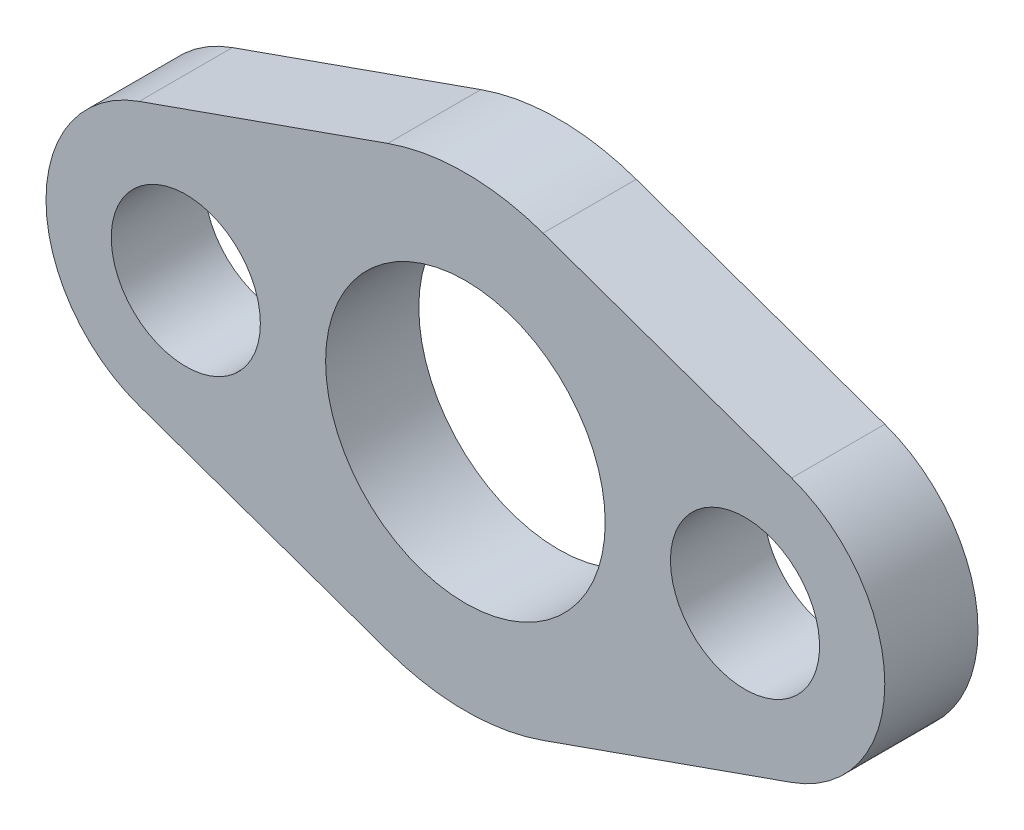
ISO-10303-21;
HEADER;
FILE_DESCRIPTION(('STEP AP214'),'2;1');
FILE_NAME('part.step','',(''),(''),'','','');
FILE_SCHEMA(('AUTOMOTIVE_DESIGN { 1 0 10303 214 1 1 1 1 }'));
ENDSEC;
DATA;
#1=APPLICATION_CONTEXT('core data for automotive mechanical design processes');
#2=APPLICATION_PROTOCOL_DEFINITION('international standard','automotive_design',2000,#1);
#3=PRODUCT_CONTEXT('',#1,'mechanical');
#4=PRODUCT('Part','Part','',(#3));
#5=PRODUCT_RELATED_PRODUCT_CATEGORY('part','',(#4));
#6=PRODUCT_DEFINITION_FORMATION('','',#4);
#7=PRODUCT_DEFINITION_CONTEXT('part definition',#1,'design');
#8=PRODUCT_DEFINITION('design','',#6,#7);
#9=PRODUCT_DEFINITION_SHAPE('','',#8);
#10=(LENGTH_UNIT() NAMED_UNIT(*) SI_UNIT(.MILLI.,.METRE.));
#11=(NAMED_UNIT(*) PLANE_ANGLE_UNIT() SI_UNIT($,.RADIAN.));
#12=(NAMED_UNIT(*) SI_UNIT($,.STERADIAN.) SOLID_ANGLE_UNIT());
#13=UNCERTAINTY_MEASURE_WITH_UNIT(LENGTH_MEASURE(1.E-05),#10,'distance_accuracy_value','');
#14=(GEOMETRIC_REPRESENTATION_CONTEXT(3) GLOBAL_UNCERTAINTY_ASSIGNED_CONTEXT((#13)) GLOBAL_UNIT_ASSIGNED_CONTEXT((#10,
#11,#12)) REPRESENTATION_CONTEXT('',''));
#15=CARTESIAN_POINT('',(0.,0.,0.));
#16=DIRECTION('',(0.,0.,1.));
#17=DIRECTION('',(1.,0.,0.));
#18=AXIS2_PLACEMENT_3D('',#15,#16,#17);
#19=CARTESIAN_POINT('',(0.,0.,10.));
#20=DIRECTION('',(0.,0.,1.));
#21=DIRECTION('',(1.,0.,0.));
#22=AXIS2_PLACEMENT_3D('',#19,#20,#21);
#23=PLANE('',#22);
#24=CARTESIAN_POINT('',(30.,0.,10.));
#25=DIRECTION('',(0.,0.,1.));
#26=DIRECTION('',(1.,0.,0.));
#27=AXIS2_PLACEMENT_3D('',#24,#25,#26);
#28=CIRCLE('',#27,15.);
#29=CARTESIAN_POINT('',(45.,0.,10.));
#30=VERTEX_POINT('',#29);
#31=EDGE_CURVE('E181',#30,#30,#28,.T.);
#32=ORIENTED_EDGE('',*,*,#31,.F.);
#33=EDGE_LOOP('',(#32));
#34=FACE_BOUND('',#33,.T.);
#35=CARTESIAN_POINT('',(0.,0.,10.));
#36=DIRECTION('',(0.,0.,1.));
#37=DIRECTION('',(1.,0.,0.));
#38=AXIS2_PLACEMENT_3D('',#35,#36,#37);
#39=CIRCLE('',#38,15.);
#40=CARTESIAN_POINT('',(-5.00000000000001,14.142135623731,10.));
#41=VERTEX_POINT('',#40);
#42=CARTESIAN_POINT('',(-5.00000000000001,-14.142135623731,10.));
#43=VERTEX_POINT('',#42);
#44=EDGE_CURVE('E144',#41,#43,#39,.T.);
#45=ORIENTED_EDGE('',*,*,#44,.T.);
#46=DIRECTION('',(0.942809041582063,-0.333333333333334,0.));
#47=VECTOR('',#46,1.);
#48=CARTESIAN_POINT('',(-5.00000000000001,-14.142135623731,10.));
#49=LINE('',#48,#47);
#50=CARTESIAN_POINT('',(21.6666666666667,-23.5702260395516,10.));
#51=VERTEX_POINT('',#50);
#52=EDGE_CURVE('E92',#43,#51,#49,.T.);
#53=ORIENTED_EDGE('',*,*,#52,.T.);
#54=CARTESIAN_POINT('',(30.,0.,10.));
#55=DIRECTION('',(0.,0.,1.));
#56=DIRECTION('',(1.,0.,0.));
#57=AXIS2_PLACEMENT_3D('',#54,#55,#56);
#58=CIRCLE('',#57,25.);
#59=CARTESIAN_POINT('',(38.3333333333333,-23.5702260395516,10.));
#60=VERTEX_POINT('',#59);
#61=EDGE_CURVE('E159',#51,#60,#58,.T.);
#62=ORIENTED_EDGE('',*,*,#61,.T.);
#63=DIRECTION('',(0.942809041582063,0.333333333333334,0.));
#64=VECTOR('',#63,1.);
#65=CARTESIAN_POINT('',(65.,-14.142135623731,10.));
#66=LINE('',#65,#64);
#67=CARTESIAN_POINT('',(65.,-14.142135623731,10.));
#68=VERTEX_POINT('',#67);
#69=EDGE_CURVE('E172',#60,#68,#66,.T.);
#70=ORIENTED_EDGE('',*,*,#69,.T.);
#71=CARTESIAN_POINT('',(60.,0.,10.));
#72=DIRECTION('',(0.,0.,1.));
#73=DIRECTION('',(-1.,0.,0.));
#74=AXIS2_PLACEMENT_3D('',#71,#72,#73);
#75=CIRCLE('',#74,15.);
#76=CARTESIAN_POINT('',(65.,14.1421356237309,10.));
#77=VERTEX_POINT('',#76);
#78=EDGE_CURVE('E111',#68,#77,#75,.T.);
#79=ORIENTED_EDGE('',*,*,#78,.T.);
#80=DIRECTION('',(-0.942809041582063,0.333333333333334,0.));
#81=VECTOR('',#80,1.);
#82=CARTESIAN_POINT('',(65.,14.142135623731,10.));
#83=LINE('',#82,#81);
#84=CARTESIAN_POINT('',(38.3333333333333,23.5702260395516,10.));
#85=VERTEX_POINT('',#84);
#86=EDGE_CURVE('E105',#77,#85,#83,.T.);
#87=ORIENTED_EDGE('',*,*,#86,.T.);
#88=CARTESIAN_POINT('',(30.,0.,10.));
#89=DIRECTION('',(0.,0.,1.));
#90=DIRECTION('',(1.,0.,0.));
#91=AXIS2_PLACEMENT_3D('',#88,#89,#90);
#92=CIRCLE('',#91,25.);
#93=CARTESIAN_POINT('',(21.6666666666667,23.5702260395516,10.));
#94=VERTEX_POINT('',#93);
#95=EDGE_CURVE('E109',#85,#94,#92,.T.);
#96=ORIENTED_EDGE('',*,*,#95,.T.);
#97=DIRECTION('',(-0.942809041582063,-0.333333333333334,0.));
#98=VECTOR('',#97,1.);
#99=CARTESIAN_POINT('',(-5.00000000000001,14.142135623731,10.));
#100=LINE('',#99,#98);
#101=EDGE_CURVE('E49',#94,#41,#100,.T.);
#102=ORIENTED_EDGE('',*,*,#101,.T.);
#103=EDGE_LOOP('',(#45,#53,#62,#70,#79,#87,#96,#102));
#104=FACE_BOUND('',#103,.T.);
#105=CARTESIAN_POINT('',(0.,0.,10.));
#106=DIRECTION('',(0.,0.,1.));
#107=DIRECTION('',(1.,0.,0.));
#108=AXIS2_PLACEMENT_3D('',#105,#106,#107);
#109=CIRCLE('',#108,8.);
#110=CARTESIAN_POINT('',(8.,0.,10.));
#111=VERTEX_POINT('',#110);
#112=EDGE_CURVE('E133',#111,#111,#109,.T.);
#113=ORIENTED_EDGE('',*,*,#112,.F.);
#114=EDGE_LOOP('',(#113));
#115=FACE_BOUND('',#114,.T.);
#116=CARTESIAN_POINT('',(60.,0.,10.));
#117=DIRECTION('',(0.,0.,1.));
#118=DIRECTION('',(-1.,0.,0.));
#119=AXIS2_PLACEMENT_3D('',#116,#117,#118);
#120=CIRCLE('',#119,8.00000000000001);
#121=CARTESIAN_POINT('',(52.,0.,10.));
#122=VERTEX_POINT('',#121);
#123=EDGE_CURVE('E187',#122,#122,#120,.T.);
#124=ORIENTED_EDGE('',*,*,#123,.F.);
#125=EDGE_LOOP('',(#124));
#126=FACE_BOUND('',#125,.T.);
#127=ADVANCED_FACE('F32',(#34,#104,#115,#126),#23,.T.);
#128=CARTESIAN_POINT('',(0.,0.,0.));
#129=DIRECTION('',(0.,0.,1.));
#130=DIRECTION('',(1.,0.,0.));
#131=AXIS2_PLACEMENT_3D('',#128,#129,#130);
#132=PLANE('',#131);
#133=CARTESIAN_POINT('',(0.,0.,0.));
#134=DIRECTION('',(0.,0.,1.));
#135=DIRECTION('',(1.,0.,0.));
#136=AXIS2_PLACEMENT_3D('',#133,#134,#135);
#137=CIRCLE('',#136,15.);
#138=CARTESIAN_POINT('',(-5.00000000000001,14.142135623731,0.));
#139=VERTEX_POINT('',#138);
#140=CARTESIAN_POINT('',(-5.00000000000001,-14.142135623731,0.));
#141=VERTEX_POINT('',#140);
#142=EDGE_CURVE('E129',#139,#141,#137,.T.);
#143=ORIENTED_EDGE('',*,*,#142,.F.);
#144=DIRECTION('',(-0.942809041582063,-0.333333333333334,0.));
#145=VECTOR('',#144,1.);
#146=CARTESIAN_POINT('',(-5.00000000000001,14.142135623731,0.));
#147=LINE('',#146,#145);
#148=CARTESIAN_POINT('',(21.6666666666667,23.5702260395516,0.));
#149=VERTEX_POINT('',#148);
#150=EDGE_CURVE('E84',#149,#139,#147,.T.);
#151=ORIENTED_EDGE('',*,*,#150,.F.);
#152=CARTESIAN_POINT('',(30.,0.,0.));
#153=DIRECTION('',(0.,0.,1.));
#154=DIRECTION('',(1.,0.,0.));
#155=AXIS2_PLACEMENT_3D('',#152,#153,#154);
#156=CIRCLE('',#155,25.);
#157=CARTESIAN_POINT('',(38.3333333333333,23.5702260395516,0.));
#158=VERTEX_POINT('',#157);
#159=EDGE_CURVE('E78',#158,#149,#156,.T.);
#160=ORIENTED_EDGE('',*,*,#159,.F.);
#161=DIRECTION('',(-0.942809041582063,0.333333333333334,0.));
#162=VECTOR('',#161,1.);
#163=CARTESIAN_POINT('',(65.,14.142135623731,0.));
#164=LINE('',#163,#162);
#165=CARTESIAN_POINT('',(65.,14.1421356237309,0.));
#166=VERTEX_POINT('',#165);
#167=EDGE_CURVE('E119',#166,#158,#164,.T.);
#168=ORIENTED_EDGE('',*,*,#167,.F.);
#169=CARTESIAN_POINT('',(60.,0.,0.));
#170=DIRECTION('',(0.,0.,1.));
#171=DIRECTION('',(-1.,0.,0.));
#172=AXIS2_PLACEMENT_3D('',#169,#170,#171);
#173=CIRCLE('',#172,15.);
#174=CARTESIAN_POINT('',(65.,-14.142135623731,0.));
#175=VERTEX_POINT('',#174);
#176=EDGE_CURVE('E139',#175,#166,#173,.T.);
#177=ORIENTED_EDGE('',*,*,#176,.F.);
#178=DIRECTION('',(0.942809041582063,0.333333333333334,0.));
#179=VECTOR('',#178,1.);
#180=CARTESIAN_POINT('',(65.,-14.142135623731,0.));
#181=LINE('',#180,#179);
#182=CARTESIAN_POINT('',(38.3333333333333,-23.5702260395516,0.));
#183=VERTEX_POINT('',#182);
#184=EDGE_CURVE('E137',#183,#175,#181,.T.);
#185=ORIENTED_EDGE('',*,*,#184,.F.);
#186=CARTESIAN_POINT('',(30.,0.,0.));
#187=DIRECTION('',(0.,0.,1.));
#188=DIRECTION('',(1.,0.,0.));
#189=AXIS2_PLACEMENT_3D('',#186,#187,#188);
#190=CIRCLE('',#189,25.);
#191=CARTESIAN_POINT('',(21.6666666666667,-23.5702260395516,0.));
#192=VERTEX_POINT('',#191);
#193=EDGE_CURVE('E135',#192,#183,#190,.T.);
#194=ORIENTED_EDGE('',*,*,#193,.F.);
#195=DIRECTION('',(0.942809041582063,-0.333333333333334,0.));
#196=VECTOR('',#195,1.);
#197=CARTESIAN_POINT('',(-5.00000000000001,-14.142135623731,0.));
#198=LINE('',#197,#196);
#199=EDGE_CURVE('E132',#141,#192,#198,.T.);
#200=ORIENTED_EDGE('',*,*,#199,.F.);
#201=EDGE_LOOP('',(#143,#151,#160,#168,#177,#185,#194,#200));
#202=FACE_BOUND('',#201,.T.);
#203=CARTESIAN_POINT('',(0.,0.,0.));
#204=DIRECTION('',(0.,0.,1.));
#205=DIRECTION('',(1.,0.,0.));
#206=AXIS2_PLACEMENT_3D('',#203,#204,#205);
#207=CIRCLE('',#206,8.);
#208=CARTESIAN_POINT('',(8.,0.,0.));
#209=VERTEX_POINT('',#208);
#210=EDGE_CURVE('E178',#209,#209,#207,.T.);
#211=ORIENTED_EDGE('',*,*,#210,.T.);
#212=EDGE_LOOP('',(#211));
#213=FACE_BOUND('',#212,.T.);
#214=CARTESIAN_POINT('',(30.,0.,0.));
#215=DIRECTION('',(0.,0.,1.));
#216=DIRECTION('',(1.,0.,0.));
#217=AXIS2_PLACEMENT_3D('',#214,#215,#216);
#218=CIRCLE('',#217,15.);
#219=CARTESIAN_POINT('',(45.,0.,0.));
#220=VERTEX_POINT('',#219);
#221=EDGE_CURVE('E184',#220,#220,#218,.T.);
#222=ORIENTED_EDGE('',*,*,#221,.T.);
#223=EDGE_LOOP('',(#222));
#224=FACE_BOUND('',#223,.T.);
#225=CARTESIAN_POINT('',(60.,0.,0.));
#226=DIRECTION('',(0.,0.,1.));
#227=DIRECTION('',(-1.,0.,0.));
#228=AXIS2_PLACEMENT_3D('',#225,#226,#227);
#229=CIRCLE('',#228,8.00000000000001);
#230=CARTESIAN_POINT('',(52.,0.,0.));
#231=VERTEX_POINT('',#230);
#232=EDGE_CURVE('E190',#231,#231,#229,.T.);
#233=ORIENTED_EDGE('',*,*,#232,.T.);
#234=EDGE_LOOP('',(#233));
#235=FACE_BOUND('',#234,.T.);
#236=ADVANCED_FACE('F163',(#202,#213,#224,#235),#132,.F.);
#237=CARTESIAN_POINT('',(0.,0.,10.));
#238=DIRECTION('',(0.,0.,-1.));
#239=DIRECTION('',(-1.,0.,0.));
#240=AXIS2_PLACEMENT_3D('',#237,#238,#239);
#241=CYLINDRICAL_SURFACE('',#240,15.);
#242=ORIENTED_EDGE('',*,*,#142,.T.);
#243=DIRECTION('',(0.,0.,-1.));
#244=VECTOR('',#243,1.);
#245=CARTESIAN_POINT('',(-5.00000000000001,-14.142135623731,10.));
#246=LINE('',#245,#244);
#247=EDGE_CURVE('E11',#43,#141,#246,.T.);
#248=ORIENTED_EDGE('',*,*,#247,.F.);
#249=ORIENTED_EDGE('',*,*,#44,.F.);
#250=DIRECTION('',(0.,0.,-1.));
#251=VECTOR('',#250,1.);
#252=CARTESIAN_POINT('',(-5.00000000000001,14.142135623731,10.));
#253=LINE('',#252,#251);
#254=EDGE_CURVE('E125',#41,#139,#253,.T.);
#255=ORIENTED_EDGE('',*,*,#254,.T.);
#256=EDGE_LOOP('',(#242,#248,#249,#255));
#257=FACE_BOUND('',#256,.T.);
#258=ADVANCED_FACE('F34',(#257),#241,.T.);
#259=CARTESIAN_POINT('',(-5.00000000000001,-14.142135623731,10.));
#260=DIRECTION('',(0.333333333333334,0.942809041582063,0.));
#261=DIRECTION('',(-0.942809041582063,0.333333333333334,0.));
#262=AXIS2_PLACEMENT_3D('',#259,#260,#261);
#263=PLANE('',#262);
#264=ORIENTED_EDGE('',*,*,#199,.T.);
#265=DIRECTION('',(0.,0.,-1.));
#266=VECTOR('',#265,1.);
#267=CARTESIAN_POINT('',(21.6666666666667,-23.5702260395516,10.));
#268=LINE('',#267,#266);
#269=EDGE_CURVE('E41',#51,#192,#268,.T.);
#270=ORIENTED_EDGE('',*,*,#269,.F.);
#271=ORIENTED_EDGE('',*,*,#52,.F.);
#272=ORIENTED_EDGE('',*,*,#247,.T.);
#273=EDGE_LOOP('',(#264,#270,#271,#272));
#274=FACE_BOUND('',#273,.T.);
#275=ADVANCED_FACE('F223',(#274),#263,.F.);
#276=CARTESIAN_POINT('',(30.,0.,10.));
#277=DIRECTION('',(0.,0.,-1.));
#278=DIRECTION('',(-1.,0.,0.));
#279=AXIS2_PLACEMENT_3D('',#276,#277,#278);
#280=CYLINDRICAL_SURFACE('',#279,25.);
#281=ORIENTED_EDGE('',*,*,#193,.T.);
#282=DIRECTION('',(0.,0.,-1.));
#283=VECTOR('',#282,1.);
#284=CARTESIAN_POINT('',(38.3333333333333,-23.5702260395516,10.));
#285=LINE('',#284,#283);
#286=EDGE_CURVE('E151',#60,#183,#285,.T.);
#287=ORIENTED_EDGE('',*,*,#286,.F.);
#288=ORIENTED_EDGE('',*,*,#61,.F.);
#289=ORIENTED_EDGE('',*,*,#269,.T.);
#290=EDGE_LOOP('',(#281,#287,#288,#289));
#291=FACE_BOUND('',#290,.T.);
#292=ADVANCED_FACE('F157',(#291),#280,.T.);
#293=CARTESIAN_POINT('',(65.,-14.142135623731,10.));
#294=DIRECTION('',(-0.333333333333334,0.942809041582063,0.));
#295=DIRECTION('',(-0.942809041582063,-0.333333333333334,0.));
#296=AXIS2_PLACEMENT_3D('',#293,#294,#295);
#297=PLANE('',#296);
#298=ORIENTED_EDGE('',*,*,#184,.T.);
#299=DIRECTION('',(0.,0.,-1.));
#300=VECTOR('',#299,1.);
#301=CARTESIAN_POINT('',(65.,-14.142135623731,10.));
#302=LINE('',#301,#300);
#303=EDGE_CURVE('E148',#68,#175,#302,.T.);
#304=ORIENTED_EDGE('',*,*,#303,.F.);
#305=ORIENTED_EDGE('',*,*,#69,.F.);
#306=ORIENTED_EDGE('',*,*,#286,.T.);
#307=EDGE_LOOP('',(#298,#304,#305,#306));
#308=FACE_BOUND('',#307,.T.);
#309=ADVANCED_FACE('F168',(#308),#297,.F.);
#310=CARTESIAN_POINT('',(60.,0.,10.));
#311=DIRECTION('',(0.,0.,-1.));
#312=DIRECTION('',(-1.,0.,0.));
#313=AXIS2_PLACEMENT_3D('',#310,#311,#312);
#314=CYLINDRICAL_SURFACE('',#313,15.);
#315=ORIENTED_EDGE('',*,*,#176,.T.);
#316=DIRECTION('',(0.,0.,-1.));
#317=VECTOR('',#316,1.);
#318=CARTESIAN_POINT('',(65.,14.1421356237309,10.));
#319=LINE('',#318,#317);
#320=EDGE_CURVE('E120',#77,#166,#319,.T.);
#321=ORIENTED_EDGE('',*,*,#320,.F.);
#322=ORIENTED_EDGE('',*,*,#78,.F.);
#323=ORIENTED_EDGE('',*,*,#303,.T.);
#324=EDGE_LOOP('',(#315,#321,#322,#323));
#325=FACE_BOUND('',#324,.T.);
#326=ADVANCED_FACE('F171',(#325),#314,.T.);
#327=CARTESIAN_POINT('',(65.,14.142135623731,10.));
#328=DIRECTION('',(-0.333333333333334,-0.942809041582063,0.));
#329=DIRECTION('',(0.942809041582063,-0.333333333333334,0.));
#330=AXIS2_PLACEMENT_3D('',#327,#328,#329);
#331=PLANE('',#330);
#332=ORIENTED_EDGE('',*,*,#167,.T.);
#333=DIRECTION('',(0.,0.,-1.));
#334=VECTOR('',#333,1.);
#335=CARTESIAN_POINT('',(38.3333333333333,23.5702260395516,10.));
#336=LINE('',#335,#334);
#337=EDGE_CURVE('E116',#85,#158,#336,.T.);
#338=ORIENTED_EDGE('',*,*,#337,.F.);
#339=ORIENTED_EDGE('',*,*,#86,.F.);
#340=ORIENTED_EDGE('',*,*,#320,.T.);
#341=EDGE_LOOP('',(#332,#338,#339,#340));
#342=FACE_BOUND('',#341,.T.);
#343=ADVANCED_FACE('F117',(#342),#331,.F.);
#344=CARTESIAN_POINT('',(30.,0.,10.));
#345=DIRECTION('',(0.,0.,-1.));
#346=DIRECTION('',(-1.,0.,0.));
#347=AXIS2_PLACEMENT_3D('',#344,#345,#346);
#348=CYLINDRICAL_SURFACE('',#347,25.);
#349=ORIENTED_EDGE('',*,*,#159,.T.);
#350=DIRECTION('',(0.,0.,-1.));
#351=VECTOR('',#350,1.);
#352=CARTESIAN_POINT('',(21.6666666666667,23.5702260395516,10.));
#353=LINE('',#352,#351);
#354=EDGE_CURVE('E121',#94,#149,#353,.T.);
#355=ORIENTED_EDGE('',*,*,#354,.F.);
#356=ORIENTED_EDGE('',*,*,#95,.F.);
#357=ORIENTED_EDGE('',*,*,#337,.T.);
#358=EDGE_LOOP('',(#349,#355,#356,#357));
#359=FACE_BOUND('',#358,.T.);
#360=ADVANCED_FACE('F123',(#359),#348,.T.);
#361=CARTESIAN_POINT('',(-5.00000000000001,14.142135623731,10.));
#362=DIRECTION('',(0.333333333333334,-0.942809041582063,0.));
#363=DIRECTION('',(0.942809041582063,0.333333333333334,0.));
#364=AXIS2_PLACEMENT_3D('',#361,#362,#363);
#365=PLANE('',#364);
#366=ORIENTED_EDGE('',*,*,#150,.T.);
#367=ORIENTED_EDGE('',*,*,#254,.F.);
#368=ORIENTED_EDGE('',*,*,#101,.F.);
#369=ORIENTED_EDGE('',*,*,#354,.T.);
#370=EDGE_LOOP('',(#366,#367,#368,#369));
#371=FACE_BOUND('',#370,.T.);
#372=ADVANCED_FACE('F211',(#371),#365,.F.);
#373=CARTESIAN_POINT('',(0.,0.,10.));
#374=DIRECTION('',(0.,0.,-1.));
#375=DIRECTION('',(-1.,0.,0.));
#376=AXIS2_PLACEMENT_3D('',#373,#374,#375);
#377=CYLINDRICAL_SURFACE('',#376,8.);
#378=ORIENTED_EDGE('',*,*,#112,.T.);
#379=EDGE_LOOP('',(#378));
#380=FACE_BOUND('',#379,.T.);
#381=ORIENTED_EDGE('',*,*,#210,.F.);
#382=EDGE_LOOP('',(#381));
#383=FACE_BOUND('',#382,.T.);
#384=ADVANCED_FACE('F208',(#380,#383),#377,.F.);
#385=CARTESIAN_POINT('',(30.,0.,10.));
#386=DIRECTION('',(0.,0.,-1.));
#387=DIRECTION('',(-1.,0.,0.));
#388=AXIS2_PLACEMENT_3D('',#385,#386,#387);
#389=CYLINDRICAL_SURFACE('',#388,15.);
#390=ORIENTED_EDGE('',*,*,#31,.T.);
#391=EDGE_LOOP('',(#390));
#392=FACE_BOUND('',#391,.T.);
#393=ORIENTED_EDGE('',*,*,#221,.F.);
#394=EDGE_LOOP('',(#393));
#395=FACE_BOUND('',#394,.T.);
#396=ADVANCED_FACE('F287',(#392,#395),#389,.F.);
#397=CARTESIAN_POINT('',(60.,0.,10.));
#398=DIRECTION('',(0.,0.,-1.));
#399=DIRECTION('',(-1.,0.,0.));
#400=AXIS2_PLACEMENT_3D('',#397,#398,#399);
#401=CYLINDRICAL_SURFACE('',#400,8.00000000000001);
#402=ORIENTED_EDGE('',*,*,#123,.T.);
#403=EDGE_LOOP('',(#402));
#404=FACE_BOUND('',#403,.T.);
#405=ORIENTED_EDGE('',*,*,#232,.F.);
#406=EDGE_LOOP('',(#405));
#407=FACE_BOUND('',#406,.T.);
#408=ADVANCED_FACE('F196',(#404,#407),#401,.F.);
#409=CLOSED_SHELL('',(#127,#236,#258,#275,#292,#309,#326,#343,#360,#372,#384,#396,#408));
#410=MANIFOLD_SOLID_BREP('B2',#409);
#411=ADVANCED_BREP_SHAPE_REPRESENTATION('',(#18,#410),#14);
#412=SHAPE_DEFINITION_REPRESENTATION(#9,#411);
ENDSEC;
END-ISO-10303-21;
